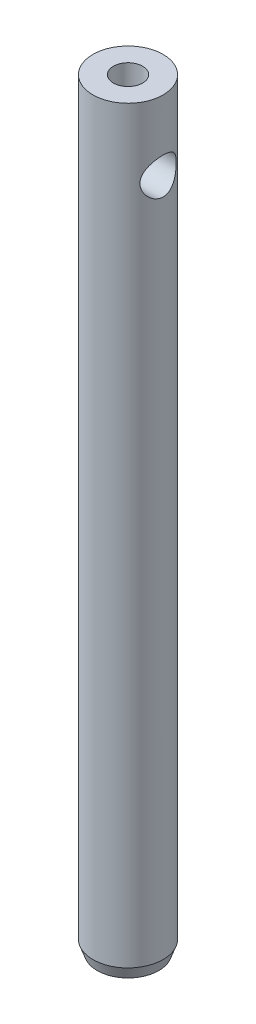
ISO-10303-21;
HEADER;
FILE_DESCRIPTION(('STEP AP214'),'2;1');
FILE_NAME('part.step','',(''),(''),'','','');
FILE_SCHEMA(('AUTOMOTIVE_DESIGN { 1 0 10303 214 1 1 1 1 }'));
ENDSEC;
DATA;
#1=APPLICATION_CONTEXT('core data for automotive mechanical design processes');
#2=APPLICATION_PROTOCOL_DEFINITION('international standard','automotive_design',2000,#1);
#3=PRODUCT_CONTEXT('',#1,'mechanical');
#4=PRODUCT('Part','Part','',(#3));
#5=PRODUCT_RELATED_PRODUCT_CATEGORY('part','',(#4));
#6=PRODUCT_DEFINITION_FORMATION('','',#4);
#7=PRODUCT_DEFINITION_CONTEXT('part definition',#1,'design');
#8=PRODUCT_DEFINITION('design','',#6,#7);
#9=PRODUCT_DEFINITION_SHAPE('','',#8);
#10=(LENGTH_UNIT() NAMED_UNIT(*) SI_UNIT(.MILLI.,.METRE.));
#11=(NAMED_UNIT(*) PLANE_ANGLE_UNIT() SI_UNIT($,.RADIAN.));
#12=(NAMED_UNIT(*) SI_UNIT($,.STERADIAN.) SOLID_ANGLE_UNIT());
#13=UNCERTAINTY_MEASURE_WITH_UNIT(LENGTH_MEASURE(1.E-05),#10,'distance_accuracy_value','');
#14=(GEOMETRIC_REPRESENTATION_CONTEXT(3) GLOBAL_UNCERTAINTY_ASSIGNED_CONTEXT((#13)) GLOBAL_UNIT_ASSIGNED_CONTEXT((#10,
#11,#12)) REPRESENTATION_CONTEXT('',''));
#15=CARTESIAN_POINT('',(0.,0.,0.));
#16=DIRECTION('',(0.,0.,1.));
#17=DIRECTION('',(1.,0.,0.));
#18=AXIS2_PLACEMENT_3D('',#15,#16,#17);
#19=CARTESIAN_POINT('',(0.,65.,0.));
#20=DIRECTION('',(0.,1.,0.));
#21=DIRECTION('',(0.,0.,1.));
#22=AXIS2_PLACEMENT_3D('',#19,#20,#21);
#23=PLANE('',#22);
#24=CARTESIAN_POINT('',(0.,65.,0.));
#25=DIRECTION('',(0.,1.,0.));
#26=DIRECTION('',(0.,0.,1.));
#27=AXIS2_PLACEMENT_3D('',#24,#25,#26);
#28=CIRCLE('',#27,1.24999999999999);
#29=CARTESIAN_POINT('',(0.,65.,1.24999999999999));
#30=VERTEX_POINT('',#29);
#31=EDGE_CURVE('E91',#30,#30,#28,.T.);
#32=ORIENTED_EDGE('',*,*,#31,.F.);
#33=EDGE_LOOP('',(#32));
#34=FACE_BOUND('',#33,.T.);
#35=CARTESIAN_POINT('',(0.,65.,0.));
#36=DIRECTION('',(0.,-1.,0.));
#37=DIRECTION('',(0.,0.,-1.));
#38=AXIS2_PLACEMENT_3D('',#35,#36,#37);
#39=CIRCLE('',#38,3.);
#40=CARTESIAN_POINT('',(0.,65.,-3.));
#41=VERTEX_POINT('',#40);
#42=EDGE_CURVE('E94',#41,#41,#39,.T.);
#43=ORIENTED_EDGE('',*,*,#42,.F.);
#44=EDGE_LOOP('',(#43));
#45=FACE_BOUND('',#44,.T.);
#46=ADVANCED_FACE('F39',(#34,#45),#23,.T.);
#47=CARTESIAN_POINT('',(0.,-5.42888574571743,0.));
#48=DIRECTION('',(0.,-1.,0.));
#49=DIRECTION('',(0.,0.,-1.));
#50=AXIS2_PLACEMENT_3D('',#47,#48,#49);
#51=CYLINDRICAL_SURFACE('',#50,3.);
#52=CARTESIAN_POINT('',(0.,0.999999999999959,0.));
#53=DIRECTION('',(0.,-1.,0.));
#54=DIRECTION('',(0.,0.,-1.));
#55=AXIS2_PLACEMENT_3D('',#52,#53,#54);
#56=CIRCLE('',#55,3.);
#57=CARTESIAN_POINT('',(0.,0.999999999999959,-3.));
#58=VERTEX_POINT('',#57);
#59=EDGE_CURVE('E10',#58,#58,#56,.F.);
#60=ORIENTED_EDGE('',*,*,#59,.T.);
#61=EDGE_LOOP('',(#60));
#62=FACE_BOUND('',#61,.T.);
#63=CARTESIAN_POINT('',(-3.,57.45,0.));
#64=CARTESIAN_POINT('',(-2.99999537089788,57.4500052581,0.0811571910938374));
#65=CARTESIAN_POINT('',(-2.99667198613769,57.4564113295135,0.162401205175879));
#66=CARTESIAN_POINT('',(-2.98370448048951,57.4817423871318,0.322467237501783));
#67=CARTESIAN_POINT('',(-2.9740494408884,57.5006889995787,0.401284825199774));
#68=CARTESIAN_POINT('',(-2.94942426610681,57.5501516665096,0.553942541484703));
#69=CARTESIAN_POINT('',(-2.9344752452331,57.580621793388,0.627801076270521));
#70=CARTESIAN_POINT('',(-2.90061565038481,57.6520174133995,0.76923658954266));
#71=CARTESIAN_POINT('',(-2.88170521980747,57.6929425280891,0.836813795276096));
#72=CARTESIAN_POINT('',(-2.84023220948414,57.7870227979441,0.968580906882854));
#73=CARTESIAN_POINT('',(-2.81751418971712,57.840788305933,1.03228532788196));
#74=CARTESIAN_POINT('',(-2.77146151785461,57.9577009722223,1.15022482176075));
#75=CARTESIAN_POINT('',(-2.74812637922862,58.0208557258634,1.20445215024937));
#76=CARTESIAN_POINT('',(-2.70120330313405,58.1611173140399,1.30648923081014));
#77=CARTESIAN_POINT('',(-2.67775957207618,58.2389512183206,1.35337394091069));
#78=CARTESIAN_POINT('',(-2.63590673492171,58.4027227332028,1.43319211235935));
#79=CARTESIAN_POINT('',(-2.61749387327315,58.4886542341302,1.46613599069839));
#80=CARTESIAN_POINT('',(-2.58955215608188,58.6608402361459,1.51491639840249));
#81=CARTESIAN_POINT('',(-2.57954726765548,58.7467509948785,1.53167906402742));
#82=CARTESIAN_POINT('',(-2.56832510020633,58.9206982701133,1.5504322336963));
#83=CARTESIAN_POINT('',(-2.56709801499813,59.0087323041851,1.55243922221982));
#84=CARTESIAN_POINT('',(-2.57319253317738,59.1721147119522,1.54230129742961));
#85=CARTESIAN_POINT('',(-2.57942483011357,59.2476260376949,1.53196008446953));
#86=CARTESIAN_POINT('',(-2.59781254539799,59.395636608667,1.50056578834274));
#87=CARTESIAN_POINT('',(-2.6099700788088,59.4681347682851,1.47950888000057));
#88=CARTESIAN_POINT('',(-2.63909184292093,59.6101296510401,1.42692348053688));
#89=CARTESIAN_POINT('',(-2.65616032364527,59.6795187995931,1.39516499725197));
#90=CARTESIAN_POINT('',(-2.6931948900567,59.8123261013957,1.32226003328842));
#91=CARTESIAN_POINT('',(-2.71316227456326,59.8757415570924,1.28110933978833));
#92=CARTESIAN_POINT('',(-2.75703642460624,60.0039217393858,1.18404201316546));
#93=CARTESIAN_POINT('',(-2.78110870294603,60.0676872185794,1.12687615066992));
#94=CARTESIAN_POINT('',(-2.8282866964176,60.1851591461301,1.00260342432816));
#95=CARTESIAN_POINT('',(-2.85139188293745,60.238860147605,0.935491212511117));
#96=CARTESIAN_POINT('',(-2.89551258123171,60.3373611608506,0.788777791303166));
#97=CARTESIAN_POINT('',(-2.91635383715828,60.3815430753327,0.708704849471569));
#98=CARTESIAN_POINT('',(-2.95207406352635,60.4554352494335,0.540916699103984));
#99=CARTESIAN_POINT('',(-2.96695806189017,60.4851577174027,0.453208011588538));
#100=CARTESIAN_POINT('',(-2.98798539660305,60.5267112450728,0.280760113824295));
#101=CARTESIAN_POINT('',(-2.99477304114118,60.539866707441,0.196419524160746));
#102=CARTESIAN_POINT('',(-3.0010855932881,60.5521101294528,0.0264689022377671));
#103=CARTESIAN_POINT('',(-3.00061430211088,60.5512054518266,-0.0591404421617324));
#104=CARTESIAN_POINT('',(-2.9928209898369,60.5360697190846,-0.221539739201025));
#105=CARTESIAN_POINT('',(-2.98607750557626,60.522963977024,-0.298466661716923));
#106=CARTESIAN_POINT('',(-2.96719922421109,60.4856077474029,-0.448859357796648));
#107=CARTESIAN_POINT('',(-2.95506384999814,60.4613560668533,-0.522324759933461));
#108=CARTESIAN_POINT('',(-2.92607802762268,60.4018292565419,-0.66602463554923));
#109=CARTESIAN_POINT('',(-2.90910922874944,60.3662744353601,-0.736118511927176));
#110=CARTESIAN_POINT('',(-2.87204849519176,60.2854768026061,-0.869563703611751));
#111=CARTESIAN_POINT('',(-2.8519552788111,60.2402300123129,-0.932912233799402));
#112=CARTESIAN_POINT('',(-2.80810596771983,60.1359676052246,-1.05800428540772));
#113=CARTESIAN_POINT('',(-2.78418580334274,60.0760134703342,-1.11890926475951));
#114=CARTESIAN_POINT('',(-2.73683648190065,59.9467784262247,-1.23019970538267));
#115=CARTESIAN_POINT('',(-2.71340773525694,59.8774900537387,-1.28057666580067));
#116=CARTESIAN_POINT('',(-2.66832311402416,59.7265804685069,-1.37215429643325));
#117=CARTESIAN_POINT('',(-2.64684681378419,59.644479033321,-1.41266019174362));
#118=CARTESIAN_POINT('',(-2.61044850074907,59.4731766098724,-1.4788525492711));
#119=CARTESIAN_POINT('',(-2.59551754632324,59.3839855049868,-1.50455924389598));
#120=CARTESIAN_POINT('',(-2.57585561622635,59.2103038312311,-1.53795658358956));
#121=CARTESIAN_POINT('',(-2.57027169153999,59.1262035098335,-1.54716011229659));
#122=CARTESIAN_POINT('',(-2.56753016065377,58.9575096319139,-1.55170937850173));
#123=CARTESIAN_POINT('',(-2.57036798210188,58.8729163679117,-1.54706263561229));
#124=CARTESIAN_POINT('',(-2.58322181370144,58.7153061299605,-1.52547998823504));
#125=CARTESIAN_POINT('',(-2.59243003353327,58.6420251364639,-1.50992456690369));
#126=CARTESIAN_POINT('',(-2.61597283092194,58.4992197164816,-1.46875628196533));
#127=CARTESIAN_POINT('',(-2.63030916164385,58.4296965840771,-1.4431399785158));
#128=CARTESIAN_POINT('',(-2.66364552397914,58.2912506289413,-1.38069574346861));
#129=CARTESIAN_POINT('',(-2.68289185984041,58.2226736318493,-1.34323674576593));
#130=CARTESIAN_POINT('',(-2.72351522679164,58.0923226311885,-1.25883212591263));
#131=CARTESIAN_POINT('',(-2.7448933936258,58.0305522911873,-1.21188143318073));
#132=CARTESIAN_POINT('',(-2.79076888465928,57.9070198538074,-1.10252915226198));
#133=CARTESIAN_POINT('',(-2.81530328538766,57.846349028637,-1.03890355388211));
#134=CARTESIAN_POINT('',(-2.86217781867696,57.7362574014072,-0.901768578594907));
#135=CARTESIAN_POINT('',(-2.88451665767506,57.6868432091135,-0.828253434745613));
#136=CARTESIAN_POINT('',(-2.9249654101906,57.6002096376069,-0.671719725833234));
#137=CARTESIAN_POINT('',(-2.94300677813279,57.56318453735,-0.588575023094202));
#138=CARTESIAN_POINT('',(-2.9722779049624,57.5041387272152,-0.416117662102293));
#139=CARTESIAN_POINT('',(-2.9835264675003,57.4820765762647,-0.326822800067342));
#140=CARTESIAN_POINT('',(-2.99377574755927,57.4620752401762,-0.197111591221042));
#141=CARTESIAN_POINT('',(-2.99610282114016,57.457554417893,-0.157869893981267));
#142=CARTESIAN_POINT('',(-2.99921609427244,57.4515154797817,-0.0790923446110297));
#143=CARTESIAN_POINT('',(-3.0000022562512,57.4499974371716,-0.0395564853315001));
#144=CARTESIAN_POINT('',(-3.,57.45,0.));
#145=B_SPLINE_CURVE_WITH_KNOTS('',3,(#63,#64,#65,#66,#67,#68,#69,#70,#71,#72,#73,#74,#75,#76,
#77,#78,#79,#80,#81,#82,#83,#84,#85,#86,#87,#88,#89,#90,#91,#92,#93,#94,#95,#96,#97,#98,#99,
#100,#101,#102,#103,#104,#105,#106,#107,#108,#109,#110,#111,#112,#113,#114,#115,#116,#117,#118,
#119,#120,#121,#122,#123,#124,#125,#126,#127,#128,#129,#130,#131,#132,#133,#134,#135,#136,#137,
#138,#139,#140,#141,#142,#143,#144),.UNSPECIFIED.,.T.,.F.,(4,2,2,2,2,2,2,2,2,2,2,2,2,2,2,2,2,2,
2,2,2,2,2,2,2,2,2,2,2,2,2,2,2,2,2,2,2,2,2,2,4),(0.,0.243311545013474,0.487043779368092,
0.729814671205957,0.972576776611061,1.23071170610758,1.48905659919067,1.76915795006661,
2.04904962997784,2.3117572006401,2.57417123976732,2.80251243731576,3.0309352029236,
3.26461853987065,3.49840690083492,3.76413445854405,4.03000541498388,4.30988543134838,
4.58952872847073,4.84500071457373,5.10033892477695,5.33423793340263,5.56816198289845,
5.80839566718477,6.04872816121011,6.31383394548569,6.57915296946553,6.8597381050212,
7.13993872810777,7.39280485418766,7.64553371878149,7.87098585035563,8.09651513181352,
8.33700671665399,8.57762711619528,8.85021371423122,9.12295996177135,9.39980216012754,
9.67587445633211,9.79446302206796,9.91305447935708),.UNSPECIFIED.);
#146=CARTESIAN_POINT('',(-3.,57.45,0.));
#147=VERTEX_POINT('',#146);
#148=EDGE_CURVE('E50',#147,#147,#145,.T.);
#149=ORIENTED_EDGE('',*,*,#148,.F.);
#150=EDGE_LOOP('',(#149));
#151=FACE_BOUND('',#150,.T.);
#152=CARTESIAN_POINT('',(2.56855990780826,59.,-1.55));
#153=CARTESIAN_POINT('',(2.56856758763115,59.0803403427119,-1.54999407109245));
#154=CARTESIAN_POINT('',(2.57238737620073,59.1607723996165,-1.54371135922679));
#155=CARTESIAN_POINT('',(2.58709992521849,59.3191331786899,-1.51891671673704));
#156=CARTESIAN_POINT('',(2.59800654738096,59.3970566799978,-1.50038081787188));
#157=CARTESIAN_POINT('',(2.62528412383221,59.5478060060939,-1.45211552860033));
#158=CARTESIAN_POINT('',(2.64162440408012,59.6206577311189,-1.42244885556849));
#159=CARTESIAN_POINT('',(2.67787992722966,59.7603297095652,-1.35295628441986));
#160=CARTESIAN_POINT('',(2.69779556339244,59.8271492982825,-1.31312926854182));
#161=CARTESIAN_POINT('',(2.74110531727557,59.959375650953,-1.22032197800243));
#162=CARTESIAN_POINT('',(2.7646513004468,60.0241352364551,-1.16649013086066));
#163=CARTESIAN_POINT('',(2.81134587456851,60.1442154031418,-1.04896817557422));
#164=CARTESIAN_POINT('',(2.83449424963512,60.1995309938149,-0.985272888962599));
#165=CARTESIAN_POINT('',(2.87980949206863,60.3031232705494,-0.844142015762804));
#166=CARTESIAN_POINT('',(2.90178054660839,60.3505885504056,-0.766042002654876));
#167=CARTESIAN_POINT('',(2.94026618916116,60.4314089436957,-0.601616567282122));
#168=CARTESIAN_POINT('',(2.95678444844663,60.4647735551243,-0.51529672994062));
#169=CARTESIAN_POINT('',(2.98140398435746,60.5138309517232,-0.343751425344189));
#170=CARTESIAN_POINT('',(2.99004437442711,60.5306630581074,-0.258930938090318));
#171=CARTESIAN_POINT('',(2.99995965106026,60.5499453588446,-0.0872652452120804));
#172=CARTESIAN_POINT('',(3.00123934620302,60.5524049424656,-0.000421398649065068));
#173=CARTESIAN_POINT('',(2.99653017783555,60.5432760240459,0.164194325558729));
#174=CARTESIAN_POINT('',(2.99120414963753,60.5329687146067,0.242060863657693));
#175=CARTESIAN_POINT('',(2.97490343836279,60.500913246055,0.394775260479541));
#176=CARTESIAN_POINT('',(2.96392832978495,60.4791642251249,0.469622891353698));
#177=CARTESIAN_POINT('',(2.93714577929528,60.4247427444537,0.615423392470294));
#178=CARTESIAN_POINT('',(2.92127731120307,60.3919318174538,0.686312903663805));
#179=CARTESIAN_POINT('',(2.88611193920134,60.3165308285318,0.821742168129233));
#180=CARTESIAN_POINT('',(2.86681384135456,60.2739373595552,0.886279697925966));
#181=CARTESIAN_POINT('',(2.82431625347965,60.1753441026644,1.01400407671659));
#182=CARTESIAN_POINT('',(2.80091965725316,60.1184339736966,1.07642304241976));
#183=CARTESIAN_POINT('',(2.75404340345798,59.9952392738128,1.19125978704577));
#184=CARTESIAN_POINT('',(2.73056369197504,59.9289467292897,1.24366896925665));
#185=CARTESIAN_POINT('',(2.68433935057199,59.7831270999694,1.34067598541859));
#186=CARTESIAN_POINT('',(2.66176585737562,59.7029939963078,1.38445282790692));
#187=CARTESIAN_POINT('',(2.62244082990642,59.5350853212899,1.45758159270672));
#188=CARTESIAN_POINT('',(2.60568292666568,59.4473182429452,1.48694930991728));
#189=CARTESIAN_POINT('',(2.58182970365164,59.2740286995725,1.52796614090751));
#190=CARTESIAN_POINT('',(2.57406462933597,59.188895170161,1.54085224706871));
#191=CARTESIAN_POINT('',(2.56719372521464,59.0173510634478,1.55227925919939));
#192=CARTESIAN_POINT('',(2.56808074500257,58.9309415995916,1.55083201076113));
#193=CARTESIAN_POINT('',(2.57770145969976,58.7704426000292,1.53476867977678));
#194=CARTESIAN_POINT('',(2.58547570331481,58.6961243063572,1.5217622123245));
#195=CARTESIAN_POINT('',(2.60653659420376,58.5508871824859,1.4853972952245));
#196=CARTESIAN_POINT('',(2.61982519455895,58.4799695666803,1.46203517760045));
#197=CARTESIAN_POINT('',(2.65111755303424,58.3398407356751,1.40452444849724));
#198=CARTESIAN_POINT('',(2.66930882951019,58.2708551199587,1.36993220782627));
#199=CARTESIAN_POINT('',(2.70821189527029,58.1392615030982,1.29132141669978));
#200=CARTESIAN_POINT('',(2.72892497964523,58.0766568094949,1.24729801391975));
#201=CARTESIAN_POINT('',(2.77392991563014,57.9506624455476,1.14406942423122));
#202=CARTESIAN_POINT('',(2.79832457859212,57.8883301978611,1.08361254709367));
#203=CARTESIAN_POINT('',(2.84553409763735,57.7743335505213,0.952771318472127));
#204=CARTESIAN_POINT('',(2.86834829825402,57.7226735595855,0.882382884381681));
#205=CARTESIAN_POINT('',(2.91079728556098,57.6299644232842,0.730528288923961));
#206=CARTESIAN_POINT('',(2.93029988061538,57.5893289499046,0.64876991169812));
#207=CARTESIAN_POINT('',(2.96289604969122,57.5228070888148,0.478280121236617));
#208=CARTESIAN_POINT('',(2.97599561330176,57.4969069135284,0.389555315148687));
#209=CARTESIAN_POINT('',(2.99329389211888,57.4629582130117,0.216791982566542));
#210=CARTESIAN_POINT('',(2.99822306876511,57.4534412694948,0.133114920491123));
#211=CARTESIAN_POINT('',(3.00097103355683,57.4481188206516,-0.0347780939831509));
#212=CARTESIAN_POINT('',(2.9987926752045,57.452307812728,-0.118993816573316));
#213=CARTESIAN_POINT('',(2.98799243472545,57.4733471722944,-0.279050183963371));
#214=CARTESIAN_POINT('',(2.97985458335338,57.4892469218148,-0.355052230531945));
#215=CARTESIAN_POINT('',(2.95845010729966,57.5319172991118,-0.50316534216494));
#216=CARTESIAN_POINT('',(2.94518279216408,57.5586893903897,-0.575275881921463));
#217=CARTESIAN_POINT('',(2.91403017134419,57.6234430167516,-0.716866547546158));
#218=CARTESIAN_POINT('',(2.89597937073075,57.6618352032286,-0.7861213167482));
#219=CARTESIAN_POINT('',(2.85708525970917,57.7482318556026,-0.917477041476119));
#220=CARTESIAN_POINT('',(2.83624069494933,57.7962406440034,-0.979574760181061));
#221=CARTESIAN_POINT('',(2.79120242805909,57.9063386834256,-1.10175313447835));
#222=CARTESIAN_POINT('',(2.76688703009447,57.9693776754481,-1.16093514660659));
#223=CARTESIAN_POINT('',(2.71937285599714,58.1047335612423,-1.26825247015974));
#224=CARTESIAN_POINT('',(2.6961752044712,58.1770595415685,-1.31637683220899));
#225=CARTESIAN_POINT('',(2.65268352260283,58.3328736726531,-1.40202611396712));
#226=CARTESIAN_POINT('',(2.6325537877284,58.4167045347525,-1.439016674449));
#227=CARTESIAN_POINT('',(2.59957382501018,58.5907432493504,-1.49779119293291));
#228=CARTESIAN_POINT('',(2.5866994604253,58.6809288211562,-1.51962562830278));
#229=CARTESIAN_POINT('',(2.57528987108191,58.8101661728962,-1.53880267262315));
#230=CARTESIAN_POINT('',(2.57277665675291,58.8479587866357,-1.54299409011397));
#231=CARTESIAN_POINT('',(2.56940980204655,58.92382738095,-1.54859424707795));
#232=CARTESIAN_POINT('',(2.56855626610983,58.9619033792064,-1.55000281143116));
#233=CARTESIAN_POINT('',(2.56855990780826,59.,-1.55));
#234=B_SPLINE_CURVE_WITH_KNOTS('',3,(#152,#153,#154,#155,#156,#157,#158,#159,#160,#161,#162,
#163,#164,#165,#166,#167,#168,#169,#170,#171,#172,#173,#174,#175,#176,#177,#178,#179,#180,#181,
#182,#183,#184,#185,#186,#187,#188,#189,#190,#191,#192,#193,#194,#195,#196,#197,#198,#199,#200,
#201,#202,#203,#204,#205,#206,#207,#208,#209,#210,#211,#212,#213,#214,#215,#216,#217,#218,#219,
#220,#221,#222,#223,#224,#225,#226,#227,#228,#229,#230,#231,#232,#233),.UNSPECIFIED.,.T.,.F.,(4,
2,2,2,2,2,2,2,2,2,2,2,2,2,2,2,2,2,2,2,2,2,2,2,2,2,2,2,2,2,2,2,2,2,2,2,2,2,2,2,4),(0.,
0.240860404934382,0.482193352303989,0.722186424528835,0.962205910303521,1.2234452790249,
1.48482227062786,1.76532798576229,2.04564445422735,2.30490154317004,2.56398924593493,
2.79905816572981,3.03414479402262,3.27229068379532,3.51051964090498,3.7723607934912,
4.03442582200953,4.31513509274971,4.59553596615625,4.85334395290183,5.11093889578024,
5.3374601824324,5.56406176722676,5.80100537313768,6.03807118035938,6.30746891746101,
6.57697772141108,6.8555195369389,7.13380029500914,7.38550951502229,7.63711769235048,
7.87028238079254,8.1034784654127,8.34613400201954,8.58889885402428,8.85718985782795,
9.12574539156814,9.40565889084488,9.68463560847094,9.79884211828698,9.91305581468469),.UNSPECIFIED.);
#235=CARTESIAN_POINT('',(2.56855990780826,59.,-1.55));
#236=VERTEX_POINT('',#235);
#237=EDGE_CURVE('E54',#236,#236,#234,.T.);
#238=ORIENTED_EDGE('',*,*,#237,.F.);
#239=EDGE_LOOP('',(#238));
#240=FACE_BOUND('',#239,.T.);
#241=ORIENTED_EDGE('',*,*,#42,.T.);
#242=EDGE_LOOP('',(#241));
#243=FACE_BOUND('',#242,.T.);
#244=ADVANCED_FACE('F66',(#62,#151,#240,#243),#51,.T.);
#245=CARTESIAN_POINT('',(0.,0.,0.));
#246=DIRECTION('',(0.,-1.,0.));
#247=DIRECTION('',(0.,0.,-1.));
#248=AXIS2_PLACEMENT_3D('',#245,#246,#247);
#249=PLANE('',#248);
#250=CARTESIAN_POINT('',(0.,0.,0.));
#251=DIRECTION('',(0.,-1.,0.));
#252=DIRECTION('',(0.,0.,-1.));
#253=AXIS2_PLACEMENT_3D('',#250,#251,#252);
#254=CIRCLE('',#253,2.63602976573381);
#255=CARTESIAN_POINT('',(0.,0.,-2.63602976573381));
#256=VERTEX_POINT('',#255);
#257=EDGE_CURVE('E46',#256,#256,#254,.T.);
#258=ORIENTED_EDGE('',*,*,#257,.T.);
#259=EDGE_LOOP('',(#258));
#260=FACE_BOUND('',#259,.T.);
#261=ADVANCED_FACE('F74',(#260),#249,.T.);
#262=CARTESIAN_POINT('',(-3.,59.,0.));
#263=DIRECTION('',(1.,0.,0.));
#264=DIRECTION('',(0.,0.,-1.));
#265=AXIS2_PLACEMENT_3D('',#262,#263,#264);
#266=CYLINDRICAL_SURFACE('',#265,1.55);
#267=CARTESIAN_POINT('',(0.,59.9165151389912,1.24999999999999));
#268=CARTESIAN_POINT('',(0.0464261954658542,59.9165295881956,1.24999369705385));
#269=CARTESIAN_POINT('',(0.0929103838285349,59.9201165948779,1.24738358122011));
#270=CARTESIAN_POINT('',(0.184409402432498,59.9337728566671,1.23718757897326));
#271=CARTESIAN_POINT('',(0.229418927387873,59.9438632828774,1.22958544009817));
#272=CARTESIAN_POINT('',(0.332615313312529,59.9733362983908,1.20647159449435));
#273=CARTESIAN_POINT('',(0.389790051844931,59.9947479575813,1.18910768832052));
#274=CARTESIAN_POINT('',(0.499342124780091,60.0425433693029,1.14743763927857));
#275=CARTESIAN_POINT('',(0.551704670667878,60.0689417339285,1.12311098335297));
#276=CARTESIAN_POINT('',(0.67061850040645,60.1341968834722,1.05780395432962));
#277=CARTESIAN_POINT('',(0.735101801461148,60.1740058978415,1.014000998063));
#278=CARTESIAN_POINT('',(0.855172866326371,60.2527148256303,0.914995245438225));
#279=CARTESIAN_POINT('',(0.91076829178791,60.2916154970955,0.859802362651771));
#280=CARTESIAN_POINT('',(1.00172239581549,60.3574535588477,0.75036316103894));
#281=CARTESIAN_POINT('',(1.03890406385881,60.3852266072567,0.698140937828887));
#282=CARTESIAN_POINT('',(1.10556472074831,60.4358984113861,0.586870218753266));
#283=CARTESIAN_POINT('',(1.13505575648753,60.4588047798972,0.527832610637269));
#284=CARTESIAN_POINT('',(1.18075197300066,60.4946607003411,0.414056033786985));
#285=CARTESIAN_POINT('',(1.19834220169726,60.5086266466027,0.360197294747429));
#286=CARTESIAN_POINT('',(1.22617996228507,60.530831812485,0.249468419959272));
#287=CARTESIAN_POINT('',(1.23643155272524,60.5390741973795,0.192599967416403));
#288=CARTESIAN_POINT('',(1.24896660916416,60.54916219603,0.0772073867034203));
#289=CARTESIAN_POINT('',(1.25122142354086,60.5509848082451,0.0186780609409235));
#290=CARTESIAN_POINT('',(1.24752149811631,60.5480015080454,-0.0979485567085854));
#291=CARTESIAN_POINT('',(1.24156651404932,60.5431953984065,-0.156045835689222));
#292=CARTESIAN_POINT('',(1.2224249223197,60.5278392151035,-0.266750128066692));
#293=CARTESIAN_POINT('',(1.20966864017284,60.5176311882792,-0.319481502563694));
#294=CARTESIAN_POINT('',(1.17790267329363,60.4924347207983,-0.42180334454282));
#295=CARTESIAN_POINT('',(1.15889138811369,60.4774450567096,-0.47139300428774));
#296=CARTESIAN_POINT('',(1.11334920468224,60.4419856231569,-0.571174742147312));
#297=CARTESIAN_POINT('',(1.08627744138837,60.4211318201472,-0.620980817783937));
#298=CARTESIAN_POINT('',(1.02655381506241,60.3760195734067,-0.715411372541673));
#299=CARTESIAN_POINT('',(0.993899024237172,60.3517593445129,-0.760033112220697));
#300=CARTESIAN_POINT('',(0.916506269401873,60.2958095662601,-0.852567415960415));
#301=CARTESIAN_POINT('',(0.870665857852687,60.2636208405822,-0.899254034113873));
#302=CARTESIAN_POINT('',(0.77268434737928,60.1982077251266,-0.98473113619769));
#303=CARTESIAN_POINT('',(0.72053504823342,60.1649820300222,-1.02351116365323));
#304=CARTESIAN_POINT('',(0.614450412707861,60.1026544424249,-1.09021514064071));
#305=CARTESIAN_POINT('',(0.56096933644485,60.073432791491,-1.11874879565492));
#306=CARTESIAN_POINT('',(0.448630991444231,60.0192431986043,-1.16832514941664));
#307=CARTESIAN_POINT('',(0.389785813213618,59.9942660369584,-1.18938419546134));
#308=CARTESIAN_POINT('',(0.286398407105259,59.9594161928046,-1.217520759617));
#309=CARTESIAN_POINT('',(0.243273870775742,59.9472666056894,-1.22691520954251));
#310=CARTESIAN_POINT('',(0.155133082643183,59.9285606912116,-1.24113502030281));
#311=CARTESIAN_POINT('',(0.110121498119407,59.9219913301622,-1.24597103116188));
#312=CARTESIAN_POINT('',(0.0190340481557227,59.9155834777781,-1.25069051519482));
#313=CARTESIAN_POINT('',(-0.0270468558238823,59.915789335512,-1.25054135646376));
#314=CARTESIAN_POINT('',(-0.118397453856422,59.9230021206734,-1.24522425165607));
#315=CARTESIAN_POINT('',(-0.163665979673601,59.9300181500436,-1.24004958887887));
#316=CARTESIAN_POINT('',(-0.262645435758906,59.9519043919261,-1.22335730362035));
#317=CARTESIAN_POINT('',(-0.315813691842169,59.9682422533595,-1.21062680545429));
#318=CARTESIAN_POINT('',(-0.418316529348909,60.0063329131228,-1.17915412727112));
#319=CARTESIAN_POINT('',(-0.467638890021555,60.028102117776,-1.16039368232445));
#320=CARTESIAN_POINT('',(-0.585391277135208,60.0857703614363,-1.10715305586825));
#321=CARTESIAN_POINT('',(-0.651511003208209,60.1234076181952,-1.06945963983696));
#322=CARTESIAN_POINT('',(-0.775604113486762,60.199663113939,-0.983183152949728));
#323=CARTESIAN_POINT('',(-0.833566951650955,60.2382825480218,-0.934586191602926));
#324=CARTESIAN_POINT('',(-0.941655451081777,60.3134647807796,-0.82569422077399));
#325=CARTESIAN_POINT('',(-0.991623129193952,60.3499786947963,-0.765206266258904));
#326=CARTESIAN_POINT('',(-1.08045591350409,60.4165193661135,-0.633539135841625));
#327=CARTESIAN_POINT('',(-1.11935644637541,60.4465667462466,-0.562395212760147));
#328=CARTESIAN_POINT('',(-1.17311502850031,60.4886301258533,-0.435233099625103));
#329=CARTESIAN_POINT('',(-1.19168312835321,60.5033391340037,-0.381664397727835));
#330=CARTESIAN_POINT('',(-1.22153156075156,60.5271072255121,-0.271324788943311));
#331=CARTESIAN_POINT('',(-1.2328174997572,60.5361706551557,-0.214556382179256));
#332=CARTESIAN_POINT('',(-1.24742841862936,60.5479207531497,-0.0990998469143371));
#333=CARTESIAN_POINT('',(-1.25072079970189,60.5505813093439,-0.040404843565092));
#334=CARTESIAN_POINT('',(-1.24901445470661,60.5492051901002,0.0767869526528158));
#335=CARTESIAN_POINT('',(-1.24401565977101,60.5451684590335,0.135283743871054));
#336=CARTESIAN_POINT('',(-1.22663465541324,60.5312113564129,0.246683604427187));
#337=CARTESIAN_POINT('',(-1.21472335917064,60.5216664426597,0.299709849455962));
#338=CARTESIAN_POINT('',(-1.18455796546893,60.4976962177198,0.402749492165424));
#339=CARTESIAN_POINT('',(-1.16630221177702,60.4832696321891,0.452762099125923));
#340=CARTESIAN_POINT('',(-1.12244544148431,60.4490271565965,0.553048200813625));
#341=CARTESIAN_POINT('',(-1.09635236298275,60.4288576761164,0.60298328231121));
#342=CARTESIAN_POINT('',(-1.03858224272962,60.3850267868197,0.697806567448626));
#343=CARTESIAN_POINT('',(-1.00690270141533,60.3613638156781,0.742692497149367));
#344=CARTESIAN_POINT('',(-0.931818508614895,60.3067095698975,0.835750337198412));
#345=CARTESIAN_POINT('',(-0.887338348797893,60.2752041667723,0.882750208242024));
#346=CARTESIAN_POINT('',(-0.792173173351798,60.2109090520996,0.969070805379872));
#347=CARTESIAN_POINT('',(-0.741479301351183,60.1781175538038,1.00838035853978));
#348=CARTESIAN_POINT('',(-0.635845527744743,60.1147022288289,1.07799926209258));
#349=CARTESIAN_POINT('',(-0.581086670505593,60.0840427044995,1.10855046384535));
#350=CARTESIAN_POINT('',(-0.465797813744143,60.0268734720601,1.16169906564327));
#351=CARTESIAN_POINT('',(-0.405279081334156,60.0003559196698,1.18431160426043));
#352=CARTESIAN_POINT('',(-0.299047936030454,59.963237320682,1.21451750671259));
#353=CARTESIAN_POINT('',(-0.254891520303916,59.9502630447387,1.22460331277557));
#354=CARTESIAN_POINT('',(-0.164531848947637,59.9301400395265,1.23996240616445));
#355=CARTESIAN_POINT('',(-0.11833725305944,59.922968774926,1.24525431969061));
#356=CARTESIAN_POINT('',(-0.0479138896637577,59.9174521321495,1.24931271943618));
#357=CARTESIAN_POINT('',(-0.0239646709537918,59.9165076804771,1.25000325350868));
#358=CARTESIAN_POINT('',(0.,59.9165151389912,1.24999999999999));
#359=B_SPLINE_CURVE_WITH_KNOTS('',3,(#267,#268,#269,#270,#271,#272,#273,#274,#275,#276,#277,
#278,#279,#280,#281,#282,#283,#284,#285,#286,#287,#288,#289,#290,#291,#292,#293,#294,#295,#296,
#297,#298,#299,#300,#301,#302,#303,#304,#305,#306,#307,#308,#309,#310,#311,#312,#313,#314,#315,
#316,#317,#318,#319,#320,#321,#322,#323,#324,#325,#326,#327,#328,#329,#330,#331,#332,#333,#334,
#335,#336,#337,#338,#339,#340,#341,#342,#343,#344,#345,#346,#347,#348,#349,#350,#351,#352,#353,
#354,#355,#356,#357,#358),.UNSPECIFIED.,.T.,.F.,(4,2,2,2,2,2,2,2,2,2,2,2,2,2,2,2,2,2,2,2,2,2,2,
2,2,2,2,2,2,2,2,2,2,2,2,2,2,2,2,2,2,2,2,2,2,4),(0.,0.13918971646577,0.278834852827846,
0.468185715100989,0.658100272314959,0.919423766026663,1.18052076094575,1.38932806040794,
1.59780628447771,1.77213103831245,1.94635930922173,2.1212111948855,2.29606828302134,
2.46098559321339,2.62594513312782,2.80649490982057,2.98713966060026,3.20512011002313,
3.42338699514904,3.62468032268307,3.82553066015082,3.96237730690625,4.09890343625921,
4.23632341181003,4.37392730540301,4.54415216092971,4.71489757135047,4.96830970065992,
5.22204651421724,5.48030282752165,5.73772289636978,5.9127297402967,6.08760168699402,
6.26318559573591,6.43877096291187,6.60360335685781,6.768478812979,6.947353622015,
7.1263086693949,7.34146419936255,7.55693003529519,7.76569601287698,7.97406169533456,
8.11491493138628,8.25521851899385,8.32706665821317),.UNSPECIFIED.);
#360=CARTESIAN_POINT('',(0.,59.9165151389912,1.24999999999999));
#361=VERTEX_POINT('',#360);
#362=EDGE_CURVE('E96',#361,#361,#359,.T.);
#363=ORIENTED_EDGE('',*,*,#362,.T.);
#364=EDGE_LOOP('',(#363));
#365=FACE_BOUND('',#364,.T.);
#366=ORIENTED_EDGE('',*,*,#148,.T.);
#367=EDGE_LOOP('',(#366));
#368=FACE_BOUND('',#367,.T.);
#369=ORIENTED_EDGE('',*,*,#237,.T.);
#370=EDGE_LOOP('',(#369));
#371=FACE_BOUND('',#370,.T.);
#372=ADVANCED_FACE('F69',(#365,#368,#371),#266,.F.);
#373=CARTESIAN_POINT('',(0.,65.,0.));
#374=DIRECTION('',(0.,1.,0.));
#375=DIRECTION('',(0.,0.,1.));
#376=AXIS2_PLACEMENT_3D('',#373,#374,#375);
#377=CYLINDRICAL_SURFACE('',#376,1.24999999999999);
#378=ORIENTED_EDGE('',*,*,#362,.F.);
#379=EDGE_LOOP('',(#378));
#380=FACE_BOUND('',#379,.T.);
#381=ORIENTED_EDGE('',*,*,#31,.T.);
#382=EDGE_LOOP('',(#381));
#383=FACE_BOUND('',#382,.T.);
#384=ADVANCED_FACE('F73',(#380,#383),#377,.F.);
#385=CARTESIAN_POINT('',(0.,0.,0.));
#386=DIRECTION('',(0.,1.,0.));
#387=DIRECTION('',(0.,0.,1.));
#388=AXIS2_PLACEMENT_3D('',#385,#386,#387);
#389=CONICAL_SURFACE('',#388,2.63602976573381,0.349065850398863);
#390=ORIENTED_EDGE('',*,*,#59,.F.);
#391=EDGE_LOOP('',(#390));
#392=FACE_BOUND('',#391,.T.);
#393=ORIENTED_EDGE('',*,*,#257,.F.);
#394=EDGE_LOOP('',(#393));
#395=FACE_BOUND('',#394,.T.);
#396=ADVANCED_FACE('F41',(#392,#395),#389,.T.);
#397=CLOSED_SHELL('',(#46,#244,#261,#372,#384,#396));
#398=MANIFOLD_SOLID_BREP('B2',#397);
#399=ADVANCED_BREP_SHAPE_REPRESENTATION('',(#18,#398),#14);
#400=SHAPE_DEFINITION_REPRESENTATION(#9,#399);
ENDSEC;
END-ISO-10303-21;
